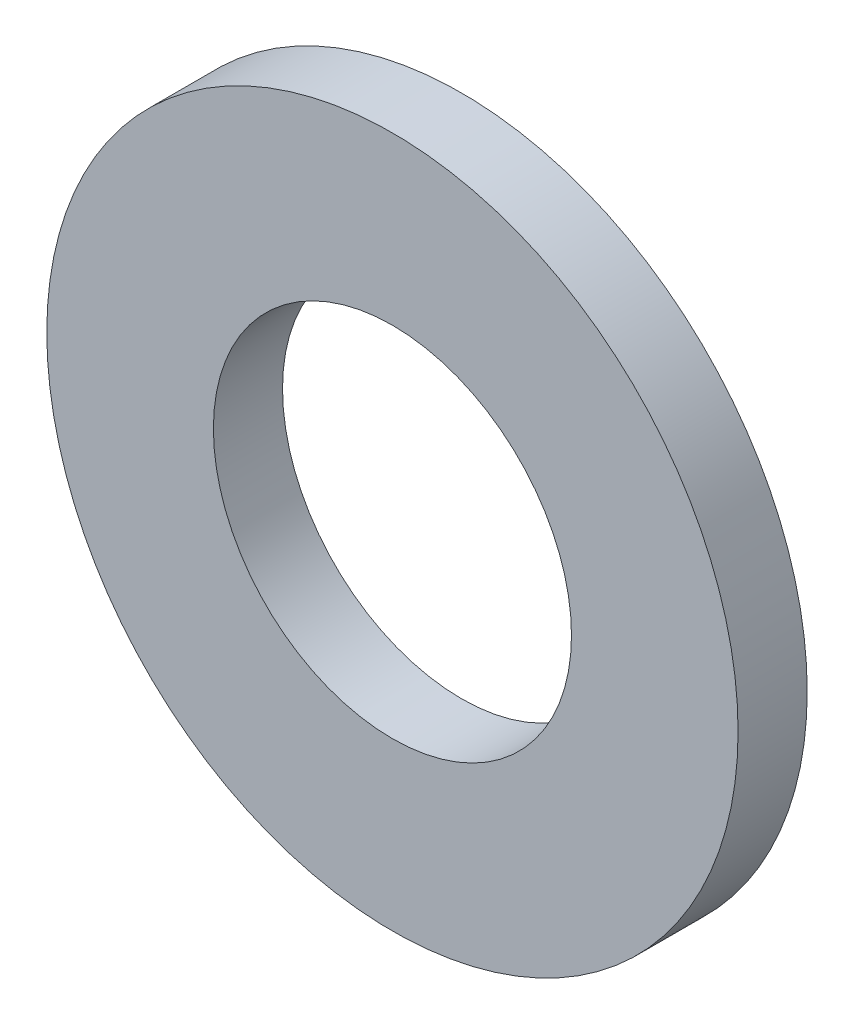
ISO-10303-21;
HEADER;
FILE_DESCRIPTION(('STEP AP214'),'2;1');
FILE_NAME('part.step','',(''),(''),'','','');
FILE_SCHEMA(('AUTOMOTIVE_DESIGN { 1 0 10303 214 1 1 1 1 }'));
ENDSEC;
DATA;
#1=APPLICATION_CONTEXT('core data for automotive mechanical design processes');
#2=APPLICATION_PROTOCOL_DEFINITION('international standard','automotive_design',2000,#1);
#3=PRODUCT_CONTEXT('',#1,'mechanical');
#4=PRODUCT('Part','Part','',(#3));
#5=PRODUCT_RELATED_PRODUCT_CATEGORY('part','',(#4));
#6=PRODUCT_DEFINITION_FORMATION('','',#4);
#7=PRODUCT_DEFINITION_CONTEXT('part definition',#1,'design');
#8=PRODUCT_DEFINITION('design','',#6,#7);
#9=PRODUCT_DEFINITION_SHAPE('','',#8);
#10=(LENGTH_UNIT() NAMED_UNIT(*) SI_UNIT(.MILLI.,.METRE.));
#11=(NAMED_UNIT(*) PLANE_ANGLE_UNIT() SI_UNIT($,.RADIAN.));
#12=(NAMED_UNIT(*) SI_UNIT($,.STERADIAN.) SOLID_ANGLE_UNIT());
#13=UNCERTAINTY_MEASURE_WITH_UNIT(LENGTH_MEASURE(1.E-05),#10,'distance_accuracy_value','');
#14=(GEOMETRIC_REPRESENTATION_CONTEXT(3) GLOBAL_UNCERTAINTY_ASSIGNED_CONTEXT((#13)) GLOBAL_UNIT_ASSIGNED_CONTEXT((#10,
#11,#12)) REPRESENTATION_CONTEXT('',''));
#15=CARTESIAN_POINT('',(0.,0.,0.));
#16=DIRECTION('',(0.,0.,1.));
#17=DIRECTION('',(1.,0.,0.));
#18=AXIS2_PLACEMENT_3D('',#15,#16,#17);
#19=CARTESIAN_POINT('',(0.,0.,-1.));
#20=DIRECTION('',(0.,0.,1.));
#21=DIRECTION('',(1.,0.,0.));
#22=AXIS2_PLACEMENT_3D('',#19,#20,#21);
#23=CYLINDRICAL_SURFACE('',#22,5.);
#24=CARTESIAN_POINT('',(0.,0.,-1.));
#25=DIRECTION('',(0.,0.,1.));
#26=DIRECTION('',(1.,0.,0.));
#27=AXIS2_PLACEMENT_3D('',#24,#25,#26);
#28=CIRCLE('',#27,5.);
#29=CARTESIAN_POINT('',(5.,0.,-1.));
#30=VERTEX_POINT('',#29);
#31=EDGE_CURVE('E10',#30,#30,#28,.T.);
#32=ORIENTED_EDGE('',*,*,#31,.T.);
#33=EDGE_LOOP('',(#32));
#34=FACE_BOUND('',#33,.T.);
#35=CARTESIAN_POINT('',(0.,0.,0.));
#36=DIRECTION('',(0.,0.,1.));
#37=DIRECTION('',(1.,0.,0.));
#38=AXIS2_PLACEMENT_3D('',#35,#36,#37);
#39=CIRCLE('',#38,5.);
#40=CARTESIAN_POINT('',(5.,0.,0.));
#41=VERTEX_POINT('',#40);
#42=EDGE_CURVE('E36',#41,#41,#39,.T.);
#43=ORIENTED_EDGE('',*,*,#42,.F.);
#44=EDGE_LOOP('',(#43));
#45=FACE_BOUND('',#44,.T.);
#46=ADVANCED_FACE('F33',(#34,#45),#23,.T.);
#47=CARTESIAN_POINT('',(0.,0.,-1.));
#48=DIRECTION('',(0.,0.,1.));
#49=DIRECTION('',(1.,0.,0.));
#50=AXIS2_PLACEMENT_3D('',#47,#48,#49);
#51=PLANE('',#50);
#52=CARTESIAN_POINT('',(0.,0.,-1.));
#53=DIRECTION('',(0.,0.,1.));
#54=DIRECTION('',(1.,0.,0.));
#55=AXIS2_PLACEMENT_3D('',#52,#53,#54);
#56=CIRCLE('',#55,2.59);
#57=CARTESIAN_POINT('',(2.59,0.,-1.));
#58=VERTEX_POINT('',#57);
#59=EDGE_CURVE('E45',#58,#58,#56,.T.);
#60=ORIENTED_EDGE('',*,*,#59,.T.);
#61=EDGE_LOOP('',(#60));
#62=FACE_BOUND('',#61,.T.);
#63=ORIENTED_EDGE('',*,*,#31,.F.);
#64=EDGE_LOOP('',(#63));
#65=FACE_BOUND('',#64,.T.);
#66=ADVANCED_FACE('F54',(#62,#65),#51,.F.);
#67=CARTESIAN_POINT('',(0.,0.,0.));
#68=DIRECTION('',(0.,0.,1.));
#69=DIRECTION('',(1.,0.,0.));
#70=AXIS2_PLACEMENT_3D('',#67,#68,#69);
#71=PLANE('',#70);
#72=CARTESIAN_POINT('',(0.,0.,0.));
#73=DIRECTION('',(0.,0.,1.));
#74=DIRECTION('',(1.,0.,0.));
#75=AXIS2_PLACEMENT_3D('',#72,#73,#74);
#76=CIRCLE('',#75,2.59);
#77=CARTESIAN_POINT('',(2.59,0.,0.));
#78=VERTEX_POINT('',#77);
#79=EDGE_CURVE('E47',#78,#78,#76,.T.);
#80=ORIENTED_EDGE('',*,*,#79,.F.);
#81=EDGE_LOOP('',(#80));
#82=FACE_BOUND('',#81,.T.);
#83=ORIENTED_EDGE('',*,*,#42,.T.);
#84=EDGE_LOOP('',(#83));
#85=FACE_BOUND('',#84,.T.);
#86=ADVANCED_FACE('F60',(#82,#85),#71,.T.);
#87=CARTESIAN_POINT('',(0.,0.,-1.));
#88=DIRECTION('',(0.,0.,1.));
#89=DIRECTION('',(1.,0.,0.));
#90=AXIS2_PLACEMENT_3D('',#87,#88,#89);
#91=CYLINDRICAL_SURFACE('',#90,2.59);
#92=ORIENTED_EDGE('',*,*,#59,.F.);
#93=EDGE_LOOP('',(#92));
#94=FACE_BOUND('',#93,.T.);
#95=ORIENTED_EDGE('',*,*,#79,.T.);
#96=EDGE_LOOP('',(#95));
#97=FACE_BOUND('',#96,.T.);
#98=ADVANCED_FACE('F57',(#94,#97),#91,.F.);
#99=CLOSED_SHELL('',(#46,#66,#86,#98));
#100=MANIFOLD_SOLID_BREP('B2',#99);
#101=ADVANCED_BREP_SHAPE_REPRESENTATION('',(#18,#100),#14);
#102=SHAPE_DEFINITION_REPRESENTATION(#9,#101);
ENDSEC;
END-ISO-10303-21;
